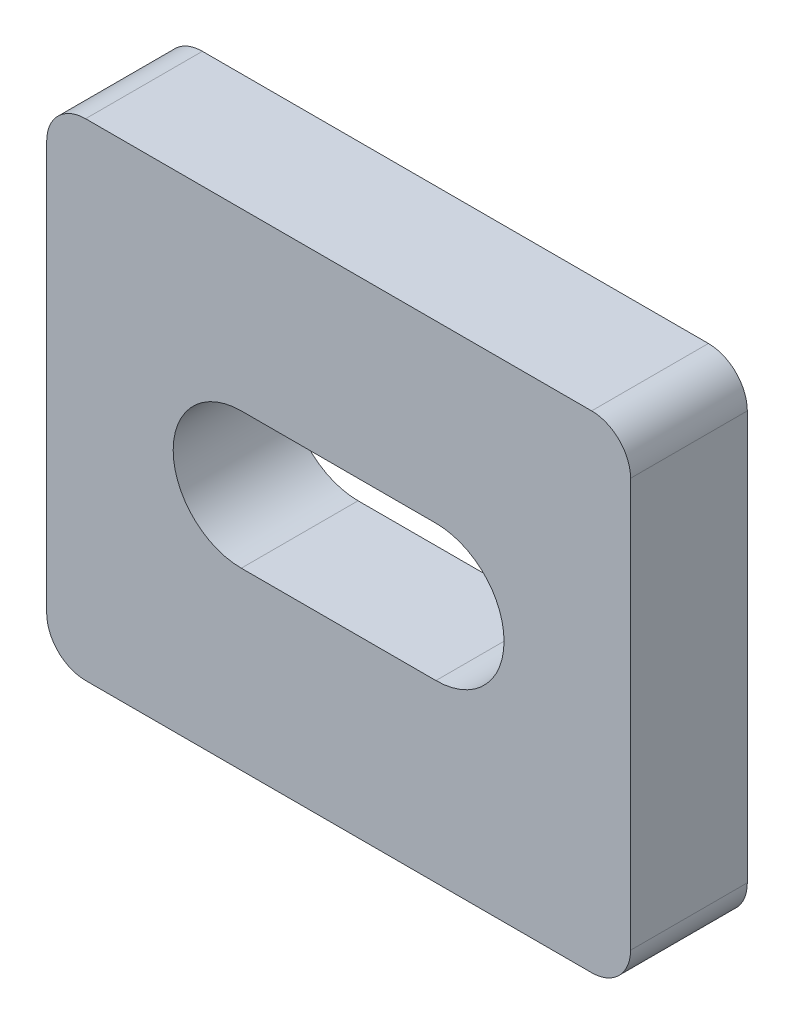
ISO-10303-21;
HEADER;
FILE_DESCRIPTION(('STEP AP214'),'2;1');
FILE_NAME('part.step','',(''),(''),'','','');
FILE_SCHEMA(('AUTOMOTIVE_DESIGN { 1 0 10303 214 1 1 1 1 }'));
ENDSEC;
DATA;
#1=APPLICATION_CONTEXT('core data for automotive mechanical design processes');
#2=APPLICATION_PROTOCOL_DEFINITION('international standard','automotive_design',2000,#1);
#3=PRODUCT_CONTEXT('',#1,'mechanical');
#4=PRODUCT('Part','Part','',(#3));
#5=PRODUCT_RELATED_PRODUCT_CATEGORY('part','',(#4));
#6=PRODUCT_DEFINITION_FORMATION('','',#4);
#7=PRODUCT_DEFINITION_CONTEXT('part definition',#1,'design');
#8=PRODUCT_DEFINITION('design','',#6,#7);
#9=PRODUCT_DEFINITION_SHAPE('','',#8);
#10=(LENGTH_UNIT() NAMED_UNIT(*) SI_UNIT(.MILLI.,.METRE.));
#11=(NAMED_UNIT(*) PLANE_ANGLE_UNIT() SI_UNIT($,.RADIAN.));
#12=(NAMED_UNIT(*) SI_UNIT($,.STERADIAN.) SOLID_ANGLE_UNIT());
#13=UNCERTAINTY_MEASURE_WITH_UNIT(LENGTH_MEASURE(1.E-05),#10,'distance_accuracy_value','');
#14=(GEOMETRIC_REPRESENTATION_CONTEXT(3) GLOBAL_UNCERTAINTY_ASSIGNED_CONTEXT((#13)) GLOBAL_UNIT_ASSIGNED_CONTEXT((#10,
#11,#12)) REPRESENTATION_CONTEXT('',''));
#15=CARTESIAN_POINT('',(0.,0.,0.));
#16=DIRECTION('',(0.,0.,1.));
#17=DIRECTION('',(1.,0.,0.));
#18=AXIS2_PLACEMENT_3D('',#15,#16,#17);
#19=CARTESIAN_POINT('',(0.,-12.5,6.));
#20=DIRECTION('',(0.,1.,0.));
#21=DIRECTION('',(0.,0.,1.));
#22=AXIS2_PLACEMENT_3D('',#19,#20,#21);
#23=PLANE('',#22);
#24=DIRECTION('',(1.,0.,0.));
#25=VECTOR('',#24,1.);
#26=CARTESIAN_POINT('',(0.,-12.5,0.));
#27=LINE('',#26,#25);
#28=CARTESIAN_POINT('',(-13.,-12.5,0.));
#29=VERTEX_POINT('',#28);
#30=CARTESIAN_POINT('',(13.,-12.5,0.));
#31=VERTEX_POINT('',#30);
#32=EDGE_CURVE('E176',#29,#31,#27,.T.);
#33=ORIENTED_EDGE('',*,*,#32,.T.);
#34=DIRECTION('',(0.,0.,-1.));
#35=VECTOR('',#34,1.);
#36=CARTESIAN_POINT('',(13.,-12.5,6.));
#37=LINE('',#36,#35);
#38=CARTESIAN_POINT('',(13.,-12.5,6.));
#39=VERTEX_POINT('',#38);
#40=EDGE_CURVE('E11',#31,#39,#37,.F.);
#41=ORIENTED_EDGE('',*,*,#40,.T.);
#42=DIRECTION('',(1.,0.,0.));
#43=VECTOR('',#42,1.);
#44=CARTESIAN_POINT('',(0.,-12.5,6.));
#45=LINE('',#44,#43);
#46=CARTESIAN_POINT('',(-13.,-12.5,6.));
#47=VERTEX_POINT('',#46);
#48=EDGE_CURVE('E156',#47,#39,#45,.T.);
#49=ORIENTED_EDGE('',*,*,#48,.F.);
#50=DIRECTION('',(0.,0.,-1.));
#51=VECTOR('',#50,1.);
#52=CARTESIAN_POINT('',(-13.,-12.5,0.));
#53=LINE('',#52,#51);
#54=EDGE_CURVE('E41',#47,#29,#53,.T.);
#55=ORIENTED_EDGE('',*,*,#54,.T.);
#56=EDGE_LOOP('',(#33,#41,#49,#55));
#57=FACE_BOUND('',#56,.T.);
#58=ADVANCED_FACE('F33',(#57),#23,.F.);
#59=CARTESIAN_POINT('',(15.,0.,6.));
#60=DIRECTION('',(-1.,0.,0.));
#61=DIRECTION('',(0.,0.,1.));
#62=AXIS2_PLACEMENT_3D('',#59,#60,#61);
#63=PLANE('',#62);
#64=DIRECTION('',(0.,1.,0.));
#65=VECTOR('',#64,1.);
#66=CARTESIAN_POINT('',(15.,0.,0.));
#67=LINE('',#66,#65);
#68=CARTESIAN_POINT('',(15.,-10.5,0.));
#69=VERTEX_POINT('',#68);
#70=CARTESIAN_POINT('',(15.,10.5,0.));
#71=VERTEX_POINT('',#70);
#72=EDGE_CURVE('E179',#69,#71,#67,.T.);
#73=ORIENTED_EDGE('',*,*,#72,.T.);
#74=DIRECTION('',(0.,0.,-1.));
#75=VECTOR('',#74,1.);
#76=CARTESIAN_POINT('',(15.,10.5,6.));
#77=LINE('',#76,#75);
#78=CARTESIAN_POINT('',(15.,10.5,6.));
#79=VERTEX_POINT('',#78);
#80=EDGE_CURVE('E48',#71,#79,#77,.F.);
#81=ORIENTED_EDGE('',*,*,#80,.T.);
#82=DIRECTION('',(0.,1.,0.));
#83=VECTOR('',#82,1.);
#84=CARTESIAN_POINT('',(15.,0.,6.));
#85=LINE('',#84,#83);
#86=CARTESIAN_POINT('',(15.,-10.5,6.));
#87=VERTEX_POINT('',#86);
#88=EDGE_CURVE('E158',#87,#79,#85,.T.);
#89=ORIENTED_EDGE('',*,*,#88,.F.);
#90=DIRECTION('',(0.,0.,-1.));
#91=VECTOR('',#90,1.);
#92=CARTESIAN_POINT('',(15.,-10.5,6.));
#93=LINE('',#92,#91);
#94=EDGE_CURVE('E211',#87,#69,#93,.T.);
#95=ORIENTED_EDGE('',*,*,#94,.T.);
#96=EDGE_LOOP('',(#73,#81,#89,#95));
#97=FACE_BOUND('',#96,.T.);
#98=ADVANCED_FACE('F229',(#97),#63,.F.);
#99=CARTESIAN_POINT('',(0.,12.5,6.));
#100=DIRECTION('',(0.,1.,0.));
#101=DIRECTION('',(0.,0.,1.));
#102=AXIS2_PLACEMENT_3D('',#99,#100,#101);
#103=PLANE('',#102);
#104=DIRECTION('',(1.,0.,0.));
#105=VECTOR('',#104,1.);
#106=CARTESIAN_POINT('',(0.,12.5,0.));
#107=LINE('',#106,#105);
#108=CARTESIAN_POINT('',(-13.,12.5,0.));
#109=VERTEX_POINT('',#108);
#110=CARTESIAN_POINT('',(13.,12.5,0.));
#111=VERTEX_POINT('',#110);
#112=EDGE_CURVE('E151',#109,#111,#107,.T.);
#113=ORIENTED_EDGE('',*,*,#112,.F.);
#114=DIRECTION('',(0.,0.,-1.));
#115=VECTOR('',#114,1.);
#116=CARTESIAN_POINT('',(-13.,12.5,6.));
#117=LINE('',#116,#115);
#118=CARTESIAN_POINT('',(-13.,12.5,6.));
#119=VERTEX_POINT('',#118);
#120=EDGE_CURVE('E202',#109,#119,#117,.F.);
#121=ORIENTED_EDGE('',*,*,#120,.T.);
#122=DIRECTION('',(1.,0.,0.));
#123=VECTOR('',#122,1.);
#124=CARTESIAN_POINT('',(0.,12.5,6.));
#125=LINE('',#124,#123);
#126=CARTESIAN_POINT('',(13.,12.5,6.));
#127=VERTEX_POINT('',#126);
#128=EDGE_CURVE('E160',#119,#127,#125,.T.);
#129=ORIENTED_EDGE('',*,*,#128,.T.);
#130=DIRECTION('',(0.,0.,-1.));
#131=VECTOR('',#130,1.);
#132=CARTESIAN_POINT('',(13.,12.5,0.));
#133=LINE('',#132,#131);
#134=EDGE_CURVE('E199',#127,#111,#133,.T.);
#135=ORIENTED_EDGE('',*,*,#134,.T.);
#136=EDGE_LOOP('',(#113,#121,#129,#135));
#137=FACE_BOUND('',#136,.T.);
#138=ADVANCED_FACE('F237',(#137),#103,.T.);
#139=CARTESIAN_POINT('',(-5.,0.,6.));
#140=DIRECTION('',(0.,0.,-1.));
#141=DIRECTION('',(-1.,0.,0.));
#142=AXIS2_PLACEMENT_3D('',#139,#140,#141);
#143=CYLINDRICAL_SURFACE('',#142,3.5);
#144=CARTESIAN_POINT('',(-5.,0.,0.));
#145=DIRECTION('',(0.,0.,1.));
#146=DIRECTION('',(1.,0.,0.));
#147=AXIS2_PLACEMENT_3D('',#144,#145,#146);
#148=CIRCLE('',#147,3.5);
#149=CARTESIAN_POINT('',(-5.,3.5,0.));
#150=VERTEX_POINT('',#149);
#151=CARTESIAN_POINT('',(-5.,-3.5,0.));
#152=VERTEX_POINT('',#151);
#153=EDGE_CURVE('E130',#150,#152,#148,.T.);
#154=ORIENTED_EDGE('',*,*,#153,.F.);
#155=DIRECTION('',(0.,0.,-1.));
#156=VECTOR('',#155,1.);
#157=CARTESIAN_POINT('',(-5.,3.5,6.));
#158=LINE('',#157,#156);
#159=CARTESIAN_POINT('',(-5.,3.5,6.));
#160=VERTEX_POINT('',#159);
#161=EDGE_CURVE('E123',#160,#150,#158,.T.);
#162=ORIENTED_EDGE('',*,*,#161,.F.);
#163=CARTESIAN_POINT('',(-5.,0.,6.));
#164=DIRECTION('',(0.,0.,1.));
#165=DIRECTION('',(1.,0.,0.));
#166=AXIS2_PLACEMENT_3D('',#163,#164,#165);
#167=CIRCLE('',#166,3.5);
#168=CARTESIAN_POINT('',(-5.,-3.5,6.));
#169=VERTEX_POINT('',#168);
#170=EDGE_CURVE('E127',#160,#169,#167,.T.);
#171=ORIENTED_EDGE('',*,*,#170,.T.);
#172=DIRECTION('',(0.,0.,-1.));
#173=VECTOR('',#172,1.);
#174=CARTESIAN_POINT('',(-5.,-3.5,6.));
#175=LINE('',#174,#173);
#176=EDGE_CURVE('E166',#169,#152,#175,.T.);
#177=ORIENTED_EDGE('',*,*,#176,.T.);
#178=EDGE_LOOP('',(#154,#162,#171,#177));
#179=FACE_BOUND('',#178,.T.);
#180=ADVANCED_FACE('F125',(#179),#143,.F.);
#181=CARTESIAN_POINT('',(0.,3.5,6.));
#182=DIRECTION('',(0.,1.,0.));
#183=DIRECTION('',(-1.,0.,0.));
#184=AXIS2_PLACEMENT_3D('',#181,#182,#183);
#185=PLANE('',#184);
#186=DIRECTION('',(1.,0.,0.));
#187=VECTOR('',#186,1.);
#188=CARTESIAN_POINT('',(0.,3.5,0.));
#189=LINE('',#188,#187);
#190=CARTESIAN_POINT('',(5.,3.5,0.));
#191=VERTEX_POINT('',#190);
#192=EDGE_CURVE('E168',#150,#191,#189,.T.);
#193=ORIENTED_EDGE('',*,*,#192,.T.);
#194=DIRECTION('',(0.,0.,-1.));
#195=VECTOR('',#194,1.);
#196=CARTESIAN_POINT('',(5.,3.5,6.));
#197=LINE('',#196,#195);
#198=CARTESIAN_POINT('',(5.,3.5,6.));
#199=VERTEX_POINT('',#198);
#200=EDGE_CURVE('E135',#199,#191,#197,.T.);
#201=ORIENTED_EDGE('',*,*,#200,.F.);
#202=DIRECTION('',(1.,0.,0.));
#203=VECTOR('',#202,1.);
#204=CARTESIAN_POINT('',(0.,3.5,6.));
#205=LINE('',#204,#203);
#206=EDGE_CURVE('E138',#160,#199,#205,.T.);
#207=ORIENTED_EDGE('',*,*,#206,.F.);
#208=ORIENTED_EDGE('',*,*,#161,.T.);
#209=EDGE_LOOP('',(#193,#201,#207,#208));
#210=FACE_BOUND('',#209,.T.);
#211=ADVANCED_FACE('F139',(#210),#185,.F.);
#212=CARTESIAN_POINT('',(5.,0.,6.));
#213=DIRECTION('',(0.,0.,-1.));
#214=DIRECTION('',(-1.,0.,0.));
#215=AXIS2_PLACEMENT_3D('',#212,#213,#214);
#216=CYLINDRICAL_SURFACE('',#215,3.5);
#217=CARTESIAN_POINT('',(5.,0.,0.));
#218=DIRECTION('',(0.,0.,1.));
#219=DIRECTION('',(1.,0.,0.));
#220=AXIS2_PLACEMENT_3D('',#217,#218,#219);
#221=CIRCLE('',#220,3.5);
#222=CARTESIAN_POINT('',(5.,-3.5,0.));
#223=VERTEX_POINT('',#222);
#224=EDGE_CURVE('E170',#223,#191,#221,.T.);
#225=ORIENTED_EDGE('',*,*,#224,.F.);
#226=DIRECTION('',(0.,0.,-1.));
#227=VECTOR('',#226,1.);
#228=CARTESIAN_POINT('',(5.,-3.5,6.));
#229=LINE('',#228,#227);
#230=CARTESIAN_POINT('',(5.,-3.5,6.));
#231=VERTEX_POINT('',#230);
#232=EDGE_CURVE('E184',#231,#223,#229,.T.);
#233=ORIENTED_EDGE('',*,*,#232,.F.);
#234=CARTESIAN_POINT('',(5.,0.,6.));
#235=DIRECTION('',(0.,0.,1.));
#236=DIRECTION('',(1.,0.,0.));
#237=AXIS2_PLACEMENT_3D('',#234,#235,#236);
#238=CIRCLE('',#237,3.5);
#239=EDGE_CURVE('E143',#231,#199,#238,.T.);
#240=ORIENTED_EDGE('',*,*,#239,.T.);
#241=ORIENTED_EDGE('',*,*,#200,.T.);
#242=EDGE_LOOP('',(#225,#233,#240,#241));
#243=FACE_BOUND('',#242,.T.);
#244=ADVANCED_FACE('F262',(#243),#216,.F.);
#245=CARTESIAN_POINT('',(0.,-3.5,6.));
#246=DIRECTION('',(0.,1.,0.));
#247=DIRECTION('',(0.,0.,1.));
#248=AXIS2_PLACEMENT_3D('',#245,#246,#247);
#249=PLANE('',#248);
#250=DIRECTION('',(1.,0.,0.));
#251=VECTOR('',#250,1.);
#252=CARTESIAN_POINT('',(0.,-3.5,0.));
#253=LINE('',#252,#251);
#254=EDGE_CURVE('E173',#152,#223,#253,.T.);
#255=ORIENTED_EDGE('',*,*,#254,.F.);
#256=ORIENTED_EDGE('',*,*,#176,.F.);
#257=DIRECTION('',(1.,0.,0.));
#258=VECTOR('',#257,1.);
#259=CARTESIAN_POINT('',(0.,-3.5,6.));
#260=LINE('',#259,#258);
#261=EDGE_CURVE('E147',#169,#231,#260,.T.);
#262=ORIENTED_EDGE('',*,*,#261,.T.);
#263=ORIENTED_EDGE('',*,*,#232,.T.);
#264=EDGE_LOOP('',(#255,#256,#262,#263));
#265=FACE_BOUND('',#264,.T.);
#266=ADVANCED_FACE('F259',(#265),#249,.T.);
#267=CARTESIAN_POINT('',(-15.,0.,6.));
#268=DIRECTION('',(-1.,0.,0.));
#269=DIRECTION('',(0.,0.,1.));
#270=AXIS2_PLACEMENT_3D('',#267,#268,#269);
#271=PLANE('',#270);
#272=DIRECTION('',(0.,1.,0.));
#273=VECTOR('',#272,1.);
#274=CARTESIAN_POINT('',(-15.,0.,6.));
#275=LINE('',#274,#273);
#276=CARTESIAN_POINT('',(-15.,-10.5,6.));
#277=VERTEX_POINT('',#276);
#278=CARTESIAN_POINT('',(-15.,10.5,6.));
#279=VERTEX_POINT('',#278);
#280=EDGE_CURVE('E163',#277,#279,#275,.T.);
#281=ORIENTED_EDGE('',*,*,#280,.T.);
#282=DIRECTION('',(0.,0.,-1.));
#283=VECTOR('',#282,1.);
#284=CARTESIAN_POINT('',(-15.,10.5,6.));
#285=LINE('',#284,#283);
#286=CARTESIAN_POINT('',(-15.,10.5,0.));
#287=VERTEX_POINT('',#286);
#288=EDGE_CURVE('E188',#279,#287,#285,.T.);
#289=ORIENTED_EDGE('',*,*,#288,.T.);
#290=DIRECTION('',(0.,1.,0.));
#291=VECTOR('',#290,1.);
#292=CARTESIAN_POINT('',(-15.,0.,0.));
#293=LINE('',#292,#291);
#294=CARTESIAN_POINT('',(-15.,-10.5,0.));
#295=VERTEX_POINT('',#294);
#296=EDGE_CURVE('E148',#295,#287,#293,.T.);
#297=ORIENTED_EDGE('',*,*,#296,.F.);
#298=DIRECTION('',(0.,0.,-1.));
#299=VECTOR('',#298,1.);
#300=CARTESIAN_POINT('',(-15.,-10.5,6.));
#301=LINE('',#300,#299);
#302=EDGE_CURVE('E134',#295,#277,#301,.F.);
#303=ORIENTED_EDGE('',*,*,#302,.T.);
#304=EDGE_LOOP('',(#281,#289,#297,#303));
#305=FACE_BOUND('',#304,.T.);
#306=ADVANCED_FACE('F244',(#305),#271,.T.);
#307=CARTESIAN_POINT('',(0.,0.,6.));
#308=DIRECTION('',(0.,0.,1.));
#309=DIRECTION('',(1.,0.,0.));
#310=AXIS2_PLACEMENT_3D('',#307,#308,#309);
#311=PLANE('',#310);
#312=ORIENTED_EDGE('',*,*,#170,.F.);
#313=ORIENTED_EDGE('',*,*,#206,.T.);
#314=ORIENTED_EDGE('',*,*,#239,.F.);
#315=ORIENTED_EDGE('',*,*,#261,.F.);
#316=EDGE_LOOP('',(#312,#313,#314,#315));
#317=FACE_BOUND('',#316,.T.);
#318=ORIENTED_EDGE('',*,*,#128,.F.);
#319=CARTESIAN_POINT('',(-13.,10.5,6.));
#320=DIRECTION('',(0.,0.,1.));
#321=DIRECTION('',(1.,0.,0.));
#322=AXIS2_PLACEMENT_3D('',#319,#320,#321);
#323=CIRCLE('',#322,2.);
#324=EDGE_CURVE('E209',#119,#279,#323,.T.);
#325=ORIENTED_EDGE('',*,*,#324,.T.);
#326=ORIENTED_EDGE('',*,*,#280,.F.);
#327=CARTESIAN_POINT('',(-13.,-10.5,6.));
#328=DIRECTION('',(0.,0.,1.));
#329=DIRECTION('',(1.,0.,0.));
#330=AXIS2_PLACEMENT_3D('',#327,#328,#329);
#331=CIRCLE('',#330,2.);
#332=EDGE_CURVE('E204',#277,#47,#331,.T.);
#333=ORIENTED_EDGE('',*,*,#332,.T.);
#334=ORIENTED_EDGE('',*,*,#48,.T.);
#335=CARTESIAN_POINT('',(13.,-10.5,6.));
#336=DIRECTION('',(0.,0.,1.));
#337=DIRECTION('',(1.,0.,0.));
#338=AXIS2_PLACEMENT_3D('',#335,#336,#337);
#339=CIRCLE('',#338,2.);
#340=EDGE_CURVE('E55',#39,#87,#339,.T.);
#341=ORIENTED_EDGE('',*,*,#340,.T.);
#342=ORIENTED_EDGE('',*,*,#88,.T.);
#343=CARTESIAN_POINT('',(13.,10.5,6.));
#344=DIRECTION('',(0.,0.,1.));
#345=DIRECTION('',(1.,0.,0.));
#346=AXIS2_PLACEMENT_3D('',#343,#344,#345);
#347=CIRCLE('',#346,2.);
#348=EDGE_CURVE('E207',#79,#127,#347,.T.);
#349=ORIENTED_EDGE('',*,*,#348,.T.);
#350=EDGE_LOOP('',(#318,#325,#326,#333,#334,#341,#342,#349));
#351=FACE_BOUND('',#350,.T.);
#352=ADVANCED_FACE('F145',(#317,#351),#311,.T.);
#353=CARTESIAN_POINT('',(0.,0.,0.));
#354=DIRECTION('',(0.,0.,1.));
#355=DIRECTION('',(1.,0.,0.));
#356=AXIS2_PLACEMENT_3D('',#353,#354,#355);
#357=PLANE('',#356);
#358=ORIENTED_EDGE('',*,*,#153,.T.);
#359=ORIENTED_EDGE('',*,*,#254,.T.);
#360=ORIENTED_EDGE('',*,*,#224,.T.);
#361=ORIENTED_EDGE('',*,*,#192,.F.);
#362=EDGE_LOOP('',(#358,#359,#360,#361));
#363=FACE_BOUND('',#362,.T.);
#364=ORIENTED_EDGE('',*,*,#296,.T.);
#365=CARTESIAN_POINT('',(-13.,10.5,0.));
#366=DIRECTION('',(0.,0.,1.));
#367=DIRECTION('',(1.,0.,0.));
#368=AXIS2_PLACEMENT_3D('',#365,#366,#367);
#369=CIRCLE('',#368,2.);
#370=EDGE_CURVE('E197',#287,#109,#369,.F.);
#371=ORIENTED_EDGE('',*,*,#370,.T.);
#372=ORIENTED_EDGE('',*,*,#112,.T.);
#373=CARTESIAN_POINT('',(13.,10.5,0.));
#374=DIRECTION('',(0.,0.,1.));
#375=DIRECTION('',(1.,0.,0.));
#376=AXIS2_PLACEMENT_3D('',#373,#374,#375);
#377=CIRCLE('',#376,2.);
#378=EDGE_CURVE('E195',#111,#71,#377,.F.);
#379=ORIENTED_EDGE('',*,*,#378,.T.);
#380=ORIENTED_EDGE('',*,*,#72,.F.);
#381=CARTESIAN_POINT('',(13.,-10.5,0.));
#382=DIRECTION('',(0.,0.,1.));
#383=DIRECTION('',(1.,0.,0.));
#384=AXIS2_PLACEMENT_3D('',#381,#382,#383);
#385=CIRCLE('',#384,2.);
#386=EDGE_CURVE('E193',#69,#31,#385,.F.);
#387=ORIENTED_EDGE('',*,*,#386,.T.);
#388=ORIENTED_EDGE('',*,*,#32,.F.);
#389=CARTESIAN_POINT('',(-13.,-10.5,0.));
#390=DIRECTION('',(0.,0.,1.));
#391=DIRECTION('',(1.,0.,0.));
#392=AXIS2_PLACEMENT_3D('',#389,#390,#391);
#393=CIRCLE('',#392,2.);
#394=EDGE_CURVE('E191',#29,#295,#393,.F.);
#395=ORIENTED_EDGE('',*,*,#394,.T.);
#396=EDGE_LOOP('',(#364,#371,#372,#379,#380,#387,#388,#395));
#397=FACE_BOUND('',#396,.T.);
#398=ADVANCED_FACE('F223',(#363,#397),#357,.F.);
#399=CARTESIAN_POINT('',(-13.,10.5,6.));
#400=DIRECTION('',(0.,0.,-1.));
#401=DIRECTION('',(-1.,0.,0.));
#402=AXIS2_PLACEMENT_3D('',#399,#400,#401);
#403=CYLINDRICAL_SURFACE('',#402,2.);
#404=ORIENTED_EDGE('',*,*,#324,.F.);
#405=ORIENTED_EDGE('',*,*,#120,.F.);
#406=ORIENTED_EDGE('',*,*,#370,.F.);
#407=ORIENTED_EDGE('',*,*,#288,.F.);
#408=EDGE_LOOP('',(#404,#405,#406,#407));
#409=FACE_BOUND('',#408,.T.);
#410=ADVANCED_FACE('F242',(#409),#403,.T.);
#411=CARTESIAN_POINT('',(13.,10.5,6.));
#412=DIRECTION('',(0.,0.,1.));
#413=DIRECTION('',(1.,0.,0.));
#414=AXIS2_PLACEMENT_3D('',#411,#412,#413);
#415=CYLINDRICAL_SURFACE('',#414,2.);
#416=ORIENTED_EDGE('',*,*,#348,.F.);
#417=ORIENTED_EDGE('',*,*,#80,.F.);
#418=ORIENTED_EDGE('',*,*,#378,.F.);
#419=ORIENTED_EDGE('',*,*,#134,.F.);
#420=EDGE_LOOP('',(#416,#417,#418,#419));
#421=FACE_BOUND('',#420,.T.);
#422=ADVANCED_FACE('F234',(#421),#415,.T.);
#423=CARTESIAN_POINT('',(13.,-10.5,6.));
#424=DIRECTION('',(0.,0.,-1.));
#425=DIRECTION('',(-1.,0.,0.));
#426=AXIS2_PLACEMENT_3D('',#423,#424,#425);
#427=CYLINDRICAL_SURFACE('',#426,2.);
#428=ORIENTED_EDGE('',*,*,#340,.F.);
#429=ORIENTED_EDGE('',*,*,#40,.F.);
#430=ORIENTED_EDGE('',*,*,#386,.F.);
#431=ORIENTED_EDGE('',*,*,#94,.F.);
#432=EDGE_LOOP('',(#428,#429,#430,#431));
#433=FACE_BOUND('',#432,.T.);
#434=ADVANCED_FACE('F228',(#433),#427,.T.);
#435=CARTESIAN_POINT('',(-13.,-10.5,6.));
#436=DIRECTION('',(0.,0.,1.));
#437=DIRECTION('',(1.,0.,0.));
#438=AXIS2_PLACEMENT_3D('',#435,#436,#437);
#439=CYLINDRICAL_SURFACE('',#438,2.);
#440=ORIENTED_EDGE('',*,*,#332,.F.);
#441=ORIENTED_EDGE('',*,*,#302,.F.);
#442=ORIENTED_EDGE('',*,*,#394,.F.);
#443=ORIENTED_EDGE('',*,*,#54,.F.);
#444=EDGE_LOOP('',(#440,#441,#442,#443));
#445=FACE_BOUND('',#444,.T.);
#446=ADVANCED_FACE('F35',(#445),#439,.T.);
#447=CLOSED_SHELL('',(#58,#98,#138,#180,#211,#244,#266,#306,#352,#398,#410,#422,#434,#446));
#448=MANIFOLD_SOLID_BREP('B2',#447);
#449=ADVANCED_BREP_SHAPE_REPRESENTATION('',(#18,#448),#14);
#450=SHAPE_DEFINITION_REPRESENTATION(#9,#449);
ENDSEC;
END-ISO-10303-21;
